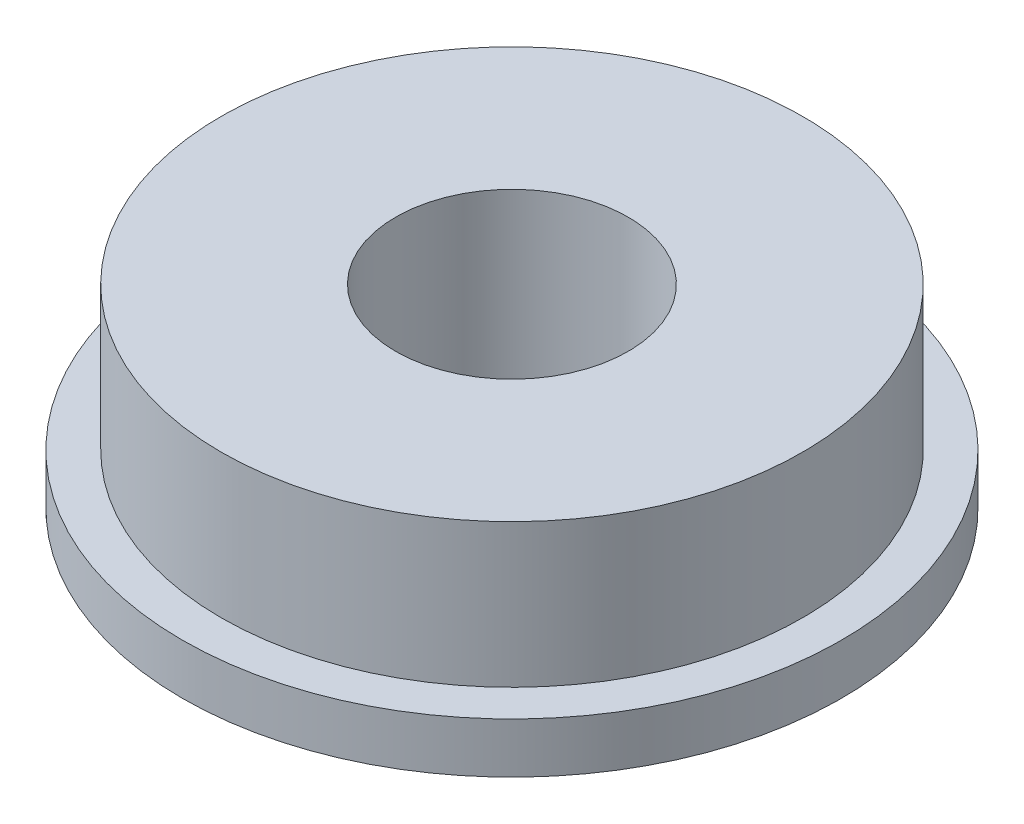
ISO-10303-21;
HEADER;
FILE_DESCRIPTION(('STEP AP214'),'2;1');
FILE_NAME('part.step','',(''),(''),'','','');
FILE_SCHEMA(('AUTOMOTIVE_DESIGN { 1 0 10303 214 1 1 1 1 }'));
ENDSEC;
DATA;
#1=APPLICATION_CONTEXT('core data for automotive mechanical design processes');
#2=APPLICATION_PROTOCOL_DEFINITION('international standard','automotive_design',2000,#1);
#3=PRODUCT_CONTEXT('',#1,'mechanical');
#4=PRODUCT('Part','Part','',(#3));
#5=PRODUCT_RELATED_PRODUCT_CATEGORY('part','',(#4));
#6=PRODUCT_DEFINITION_FORMATION('','',#4);
#7=PRODUCT_DEFINITION_CONTEXT('part definition',#1,'design');
#8=PRODUCT_DEFINITION('design','',#6,#7);
#9=PRODUCT_DEFINITION_SHAPE('','',#8);
#10=(LENGTH_UNIT() NAMED_UNIT(*) SI_UNIT(.MILLI.,.METRE.));
#11=(NAMED_UNIT(*) PLANE_ANGLE_UNIT() SI_UNIT($,.RADIAN.));
#12=(NAMED_UNIT(*) SI_UNIT($,.STERADIAN.) SOLID_ANGLE_UNIT());
#13=UNCERTAINTY_MEASURE_WITH_UNIT(LENGTH_MEASURE(1.E-05),#10,'distance_accuracy_value','');
#14=(GEOMETRIC_REPRESENTATION_CONTEXT(3) GLOBAL_UNCERTAINTY_ASSIGNED_CONTEXT((#13)) GLOBAL_UNIT_ASSIGNED_CONTEXT((#10,
#11,#12)) REPRESENTATION_CONTEXT('',''));
#15=CARTESIAN_POINT('',(0.,0.,0.));
#16=DIRECTION('',(0.,0.,1.));
#17=DIRECTION('',(1.,0.,0.));
#18=AXIS2_PLACEMENT_3D('',#15,#16,#17);
#19=CARTESIAN_POINT('',(0.,9.41666666666666,0.));
#20=DIRECTION('',(0.,1.,0.));
#21=DIRECTION('',(0.,0.,1.));
#22=AXIS2_PLACEMENT_3D('',#19,#20,#21);
#23=CYLINDRICAL_SURFACE('',#22,3.);
#24=CARTESIAN_POINT('',(0.,5.,0.));
#25=DIRECTION('',(0.,1.,0.));
#26=DIRECTION('',(0.,0.,1.));
#27=AXIS2_PLACEMENT_3D('',#24,#25,#26);
#28=CIRCLE('',#27,3.);
#29=CARTESIAN_POINT('',(0.,5.,3.));
#30=VERTEX_POINT('',#29);
#31=EDGE_CURVE('E55',#30,#30,#28,.T.);
#32=ORIENTED_EDGE('',*,*,#31,.T.);
#33=EDGE_LOOP('',(#32));
#34=FACE_BOUND('',#33,.T.);
#35=CARTESIAN_POINT('',(0.,0.,0.));
#36=DIRECTION('',(0.,1.,0.));
#37=DIRECTION('',(0.,0.,1.));
#38=AXIS2_PLACEMENT_3D('',#35,#36,#37);
#39=CIRCLE('',#38,3.);
#40=CARTESIAN_POINT('',(0.,0.,3.));
#41=VERTEX_POINT('',#40);
#42=EDGE_CURVE('E10',#41,#41,#39,.T.);
#43=ORIENTED_EDGE('',*,*,#42,.F.);
#44=EDGE_LOOP('',(#43));
#45=FACE_BOUND('',#44,.T.);
#46=ADVANCED_FACE('F33',(#34,#45),#23,.F.);
#47=CARTESIAN_POINT('',(-3.,0.,0.));
#48=DIRECTION('',(0.,-1.,0.));
#49=DIRECTION('',(0.,0.,-1.));
#50=AXIS2_PLACEMENT_3D('',#47,#48,#49);
#51=PLANE('',#50);
#52=ORIENTED_EDGE('',*,*,#42,.T.);
#53=EDGE_LOOP('',(#52));
#54=FACE_BOUND('',#53,.T.);
#55=CARTESIAN_POINT('',(0.,0.,0.));
#56=DIRECTION('',(0.,1.,0.));
#57=DIRECTION('',(0.,0.,1.));
#58=AXIS2_PLACEMENT_3D('',#55,#56,#57);
#59=CIRCLE('',#58,8.5);
#60=CARTESIAN_POINT('',(0.,0.,8.5));
#61=VERTEX_POINT('',#60);
#62=EDGE_CURVE('E39',#61,#61,#59,.T.);
#63=ORIENTED_EDGE('',*,*,#62,.F.);
#64=EDGE_LOOP('',(#63));
#65=FACE_BOUND('',#64,.T.);
#66=ADVANCED_FACE('F73',(#54,#65),#51,.T.);
#67=CARTESIAN_POINT('',(0.,9.41666666666666,0.));
#68=DIRECTION('',(0.,1.,0.));
#69=DIRECTION('',(0.,0.,1.));
#70=AXIS2_PLACEMENT_3D('',#67,#68,#69);
#71=CYLINDRICAL_SURFACE('',#70,8.5);
#72=ORIENTED_EDGE('',*,*,#62,.T.);
#73=EDGE_LOOP('',(#72));
#74=FACE_BOUND('',#73,.T.);
#75=CARTESIAN_POINT('',(0.,1.3,0.));
#76=DIRECTION('',(0.,1.,0.));
#77=DIRECTION('',(0.,0.,1.));
#78=AXIS2_PLACEMENT_3D('',#75,#76,#77);
#79=CIRCLE('',#78,8.5);
#80=CARTESIAN_POINT('',(0.,1.3,8.5));
#81=VERTEX_POINT('',#80);
#82=EDGE_CURVE('E43',#81,#81,#79,.T.);
#83=ORIENTED_EDGE('',*,*,#82,.F.);
#84=EDGE_LOOP('',(#83));
#85=FACE_BOUND('',#84,.T.);
#86=ADVANCED_FACE('F77',(#74,#85),#71,.T.);
#87=CARTESIAN_POINT('',(-8.5,1.3,0.));
#88=DIRECTION('',(0.,1.,0.));
#89=DIRECTION('',(0.,0.,1.));
#90=AXIS2_PLACEMENT_3D('',#87,#88,#89);
#91=PLANE('',#90);
#92=ORIENTED_EDGE('',*,*,#82,.T.);
#93=EDGE_LOOP('',(#92));
#94=FACE_BOUND('',#93,.T.);
#95=CARTESIAN_POINT('',(0.,1.3,0.));
#96=DIRECTION('',(0.,1.,0.));
#97=DIRECTION('',(0.,0.,1.));
#98=AXIS2_PLACEMENT_3D('',#95,#96,#97);
#99=CIRCLE('',#98,7.5);
#100=CARTESIAN_POINT('',(0.,1.3,7.5));
#101=VERTEX_POINT('',#100);
#102=EDGE_CURVE('E47',#101,#101,#99,.T.);
#103=ORIENTED_EDGE('',*,*,#102,.F.);
#104=EDGE_LOOP('',(#103));
#105=FACE_BOUND('',#104,.T.);
#106=ADVANCED_FACE('F69',(#94,#105),#91,.T.);
#107=CARTESIAN_POINT('',(0.,9.41666666666666,0.));
#108=DIRECTION('',(0.,1.,0.));
#109=DIRECTION('',(0.,0.,1.));
#110=AXIS2_PLACEMENT_3D('',#107,#108,#109);
#111=CYLINDRICAL_SURFACE('',#110,7.5);
#112=ORIENTED_EDGE('',*,*,#102,.T.);
#113=EDGE_LOOP('',(#112));
#114=FACE_BOUND('',#113,.T.);
#115=CARTESIAN_POINT('',(0.,5.,0.));
#116=DIRECTION('',(0.,1.,0.));
#117=DIRECTION('',(0.,0.,1.));
#118=AXIS2_PLACEMENT_3D('',#115,#116,#117);
#119=CIRCLE('',#118,7.5);
#120=CARTESIAN_POINT('',(0.,5.,7.5));
#121=VERTEX_POINT('',#120);
#122=EDGE_CURVE('E52',#121,#121,#119,.T.);
#123=ORIENTED_EDGE('',*,*,#122,.F.);
#124=EDGE_LOOP('',(#123));
#125=FACE_BOUND('',#124,.T.);
#126=ADVANCED_FACE('F63',(#114,#125),#111,.T.);
#127=CARTESIAN_POINT('',(-7.5,5.,0.));
#128=DIRECTION('',(0.,1.,0.));
#129=DIRECTION('',(0.,0.,1.));
#130=AXIS2_PLACEMENT_3D('',#127,#128,#129);
#131=PLANE('',#130);
#132=ORIENTED_EDGE('',*,*,#122,.T.);
#133=EDGE_LOOP('',(#132));
#134=FACE_BOUND('',#133,.T.);
#135=ORIENTED_EDGE('',*,*,#31,.F.);
#136=EDGE_LOOP('',(#135));
#137=FACE_BOUND('',#136,.T.);
#138=ADVANCED_FACE('F61',(#134,#137),#131,.T.);
#139=CLOSED_SHELL('',(#46,#66,#86,#106,#126,#138));
#140=MANIFOLD_SOLID_BREP('B2',#139);
#141=ADVANCED_BREP_SHAPE_REPRESENTATION('',(#18,#140),#14);
#142=SHAPE_DEFINITION_REPRESENTATION(#9,#141);
ENDSEC;
END-ISO-10303-21;
